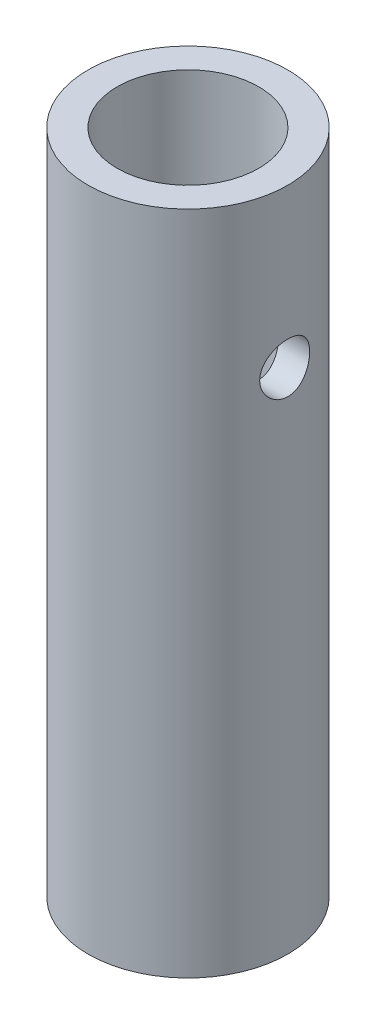
ISO-10303-21;
HEADER;
FILE_DESCRIPTION(('STEP AP214'),'2;1');
FILE_NAME('part.step','',(''),(''),'','','');
FILE_SCHEMA(('AUTOMOTIVE_DESIGN { 1 0 10303 214 1 1 1 1 }'));
ENDSEC;
DATA;
#1=APPLICATION_CONTEXT('core data for automotive mechanical design processes');
#2=APPLICATION_PROTOCOL_DEFINITION('international standard','automotive_design',2000,#1);
#3=PRODUCT_CONTEXT('',#1,'mechanical');
#4=PRODUCT('Part','Part','',(#3));
#5=PRODUCT_RELATED_PRODUCT_CATEGORY('part','',(#4));
#6=PRODUCT_DEFINITION_FORMATION('','',#4);
#7=PRODUCT_DEFINITION_CONTEXT('part definition',#1,'design');
#8=PRODUCT_DEFINITION('design','',#6,#7);
#9=PRODUCT_DEFINITION_SHAPE('','',#8);
#10=(LENGTH_UNIT() NAMED_UNIT(*) SI_UNIT(.MILLI.,.METRE.));
#11=(NAMED_UNIT(*) PLANE_ANGLE_UNIT() SI_UNIT($,.RADIAN.));
#12=(NAMED_UNIT(*) SI_UNIT($,.STERADIAN.) SOLID_ANGLE_UNIT());
#13=UNCERTAINTY_MEASURE_WITH_UNIT(LENGTH_MEASURE(1.E-05),#10,'distance_accuracy_value','');
#14=(GEOMETRIC_REPRESENTATION_CONTEXT(3) GLOBAL_UNCERTAINTY_ASSIGNED_CONTEXT((#13)) GLOBAL_UNIT_ASSIGNED_CONTEXT((#10,
#11,#12)) REPRESENTATION_CONTEXT('',''));
#15=CARTESIAN_POINT('',(0.,0.,0.));
#16=DIRECTION('',(0.,0.,1.));
#17=DIRECTION('',(1.,0.,0.));
#18=AXIS2_PLACEMENT_3D('',#15,#16,#17);
#19=CARTESIAN_POINT('',(0.,40.,0.));
#20=DIRECTION('',(0.,-1.,0.));
#21=DIRECTION('',(0.,0.,-1.));
#22=AXIS2_PLACEMENT_3D('',#19,#20,#21);
#23=CYLINDRICAL_SURFACE('',#22,6.);
#24=CARTESIAN_POINT('',(0.,40.,0.));
#25=DIRECTION('',(0.,1.,0.));
#26=DIRECTION('',(0.,0.,1.));
#27=AXIS2_PLACEMENT_3D('',#24,#25,#26);
#28=CIRCLE('',#27,6.);
#29=CARTESIAN_POINT('',(0.,40.,6.));
#30=VERTEX_POINT('',#29);
#31=EDGE_CURVE('E10',#30,#30,#28,.T.);
#32=ORIENTED_EDGE('',*,*,#31,.F.);
#33=EDGE_LOOP('',(#32));
#34=FACE_BOUND('',#33,.T.);
#35=CARTESIAN_POINT('',(0.,0.,0.));
#36=DIRECTION('',(0.,1.,0.));
#37=DIRECTION('',(0.,0.,1.));
#38=AXIS2_PLACEMENT_3D('',#35,#36,#37);
#39=CIRCLE('',#38,6.);
#40=CARTESIAN_POINT('',(0.,0.,6.));
#41=VERTEX_POINT('',#40);
#42=EDGE_CURVE('E51',#41,#41,#39,.T.);
#43=ORIENTED_EDGE('',*,*,#42,.T.);
#44=EDGE_LOOP('',(#43));
#45=FACE_BOUND('',#44,.T.);
#46=CARTESIAN_POINT('',(-5.80947501931113,30.5,1.5));
#47=CARTESIAN_POINT('',(-5.80947660051185,30.5828304505548,1.49999764715507));
#48=CARTESIAN_POINT('',(-5.81126583608348,30.6656869392068,1.49311574729838));
#49=CARTESIAN_POINT('',(-5.81821117195949,30.8290205469044,1.46581387527849));
#50=CARTESIAN_POINT('',(-5.82336923173088,30.909496252681,1.44538602404532));
#51=CARTESIAN_POINT('',(-5.8364323475758,31.0656821229122,1.39169471977917));
#52=CARTESIAN_POINT('',(-5.84433385614245,31.1413982932314,1.35844783671268));
#53=CARTESIAN_POINT('',(-5.86198915217285,31.2861865115239,1.28011268475685));
#54=CARTESIAN_POINT('',(-5.87174301827101,31.3552582772481,1.23502391313642));
#55=CARTESIAN_POINT('',(-5.89224429813367,31.4863169871573,1.13322505638713));
#56=CARTESIAN_POINT('',(-5.90300758573818,31.54813616021,1.07630213262243));
#57=CARTESIAN_POINT('',(-5.92417725309179,31.6614568366162,0.9529092384604));
#58=CARTESIAN_POINT('',(-5.93458359939834,31.7129573753731,0.886438376508187));
#59=CARTESIAN_POINT('',(-5.95404249312349,31.8048652805788,0.744687120647375));
#60=CARTESIAN_POINT('',(-5.96307412440355,31.8451078328969,0.669296745717073));
#61=CARTESIAN_POINT('',(-5.97858487155591,31.9122857864919,0.512557910575657));
#62=CARTESIAN_POINT('',(-5.98506436400607,31.9392231511493,0.431210331475164));
#63=CARTESIAN_POINT('',(-5.99462855308908,31.9784887007472,0.266615255252497));
#64=CARTESIAN_POINT('',(-5.99777936306589,31.9911017865959,0.183439631729385));
#65=CARTESIAN_POINT('',(-6.00056156464379,32.0022550275653,0.0160972915576614));
#66=CARTESIAN_POINT('',(-6.00019347658022,32.0007972633258,-0.0680692767228413));
#67=CARTESIAN_POINT('',(-5.99602856972121,31.9840550898499,-0.233028370758581));
#68=CARTESIAN_POINT('',(-5.99230801404524,31.9690782049677,-0.313854323401601));
#69=CARTESIAN_POINT('',(-5.98194501914912,31.9262172379709,-0.47180737112053));
#70=CARTESIAN_POINT('',(-5.97530242439065,31.8983324687736,-0.548934269055657));
#71=CARTESIAN_POINT('',(-5.95972505820537,31.8301984575878,-0.69811005525271));
#72=CARTESIAN_POINT('',(-5.95077011817032,31.789839773203,-0.770106764649756));
#73=CARTESIAN_POINT('',(-5.9315394228579,31.6979865925302,-0.906413433510732));
#74=CARTESIAN_POINT('',(-5.92126343791494,31.6464901588636,-0.970722052628257));
#75=CARTESIAN_POINT('',(-5.90018228261712,31.5321747548106,-1.09166105262743));
#76=CARTESIAN_POINT('',(-5.88937031715551,31.4690870645913,-1.1480365186128));
#77=CARTESIAN_POINT('',(-5.86869026110024,31.3342400158758,-1.24946456394453));
#78=CARTESIAN_POINT('',(-5.85882221463582,31.2624802523054,-1.29451661406903));
#79=CARTESIAN_POINT('',(-5.84112298098989,31.1118259795106,-1.3721821935339));
#80=CARTESIAN_POINT('',(-5.83330190235432,31.0328985618121,-1.40473435045574));
#81=CARTESIAN_POINT('',(-5.82071184083974,30.8704487191541,-1.45602843095451));
#82=CARTESIAN_POINT('',(-5.81594220486131,30.7869272816101,-1.47477330982937));
#83=CARTESIAN_POINT('',(-5.81013213623485,30.6200242990861,-1.49749778319911));
#84=CARTESIAN_POINT('',(-5.80899653456189,30.5366973240022,-1.50185428435178));
#85=CARTESIAN_POINT('',(-5.81032406088624,30.3705068380531,-1.49671019430933));
#86=CARTESIAN_POINT('',(-5.8127868576076,30.2876432852293,-1.48721087870928));
#87=CARTESIAN_POINT('',(-5.82094249172736,30.1261314410272,-1.4549552783626));
#88=CARTESIAN_POINT('',(-5.82658182140625,30.0474363640575,-1.43241844096905));
#89=CARTESIAN_POINT('',(-5.84040430962577,29.894941125289,-1.37497084900237));
#90=CARTESIAN_POINT('',(-5.84858776949168,29.8211415445668,-1.34005862862753));
#91=CARTESIAN_POINT('',(-5.86677682255957,29.6789352332796,-1.25806240076193));
#92=CARTESIAN_POINT('',(-5.87681501163985,29.6106626959741,-1.21075305230138));
#93=CARTESIAN_POINT('',(-5.8975024984303,29.4828869823192,-1.10559043940169));
#94=CARTESIAN_POINT('',(-5.90815189637082,29.42338525001,-1.04773544220816));
#95=CARTESIAN_POINT('',(-5.92918441818964,29.3133133744574,-0.921394081477092));
#96=CARTESIAN_POINT('',(-5.93955421237101,29.2630039624707,-0.852677928797392));
#97=CARTESIAN_POINT('',(-5.95858329968241,29.1746384798293,-0.707554024042016));
#98=CARTESIAN_POINT('',(-5.96724268202376,29.1365817700351,-0.631146673436389));
#99=CARTESIAN_POINT('',(-5.98182069442989,29.0741323792832,-0.473337302596637));
#100=CARTESIAN_POINT('',(-5.98775898013446,29.0496414293726,-0.391976071541823));
#101=CARTESIAN_POINT('',(-5.99631176037473,29.0147237992349,-0.226124640478213));
#102=CARTESIAN_POINT('',(-5.99892689636045,29.0042944047566,-0.141635047561867));
#103=CARTESIAN_POINT('',(-6.00051254113217,28.9979486156367,0.025625289664988));
#104=CARTESIAN_POINT('',(-5.99957968320012,29.0016474363569,0.108380740449049));
#105=CARTESIAN_POINT('',(-5.99438844686135,29.0225717409415,0.272051244622109));
#106=CARTESIAN_POINT('',(-5.99013016735643,29.0397968225196,0.352966352671329));
#107=CARTESIAN_POINT('',(-5.97878149280944,29.0870783296564,0.510256553467223));
#108=CARTESIAN_POINT('',(-5.97170646753999,29.1170651799719,0.586653741871528));
#109=CARTESIAN_POINT('',(-5.95546933370076,29.188955868529,0.733375579562202));
#110=CARTESIAN_POINT('',(-5.94630696206604,29.2308612090043,0.803699461897576));
#111=CARTESIAN_POINT('',(-5.92660874521999,29.3265728509956,0.938102892635849));
#112=CARTESIAN_POINT('',(-5.91604525418417,29.3806402143611,1.00199248245088));
#113=CARTESIAN_POINT('',(-5.89485973579863,29.4986342779607,1.11992253040688));
#114=CARTESIAN_POINT('',(-5.88423769428834,29.5625634741469,1.17396048760229));
#115=CARTESIAN_POINT('',(-5.86391213790822,29.699902121302,1.27164303971884));
#116=CARTESIAN_POINT('',(-5.85422945594827,29.7734661851189,1.31507492916982));
#117=CARTESIAN_POINT('',(-5.83715933325924,29.927083234884,1.3888903449235));
#118=CARTESIAN_POINT('',(-5.82977022370054,30.0071314491601,1.41928336463958));
#119=CARTESIAN_POINT('',(-5.81927863109675,30.1558655177401,1.46163379284816));
#120=CARTESIAN_POINT('',(-5.8156299450082,30.2238397465758,1.47598975589307));
#121=CARTESIAN_POINT('',(-5.81072757878358,30.3612033034999,1.4951734388599));
#122=CARTESIAN_POINT('',(-5.80947369434945,30.4305925103676,1.50000197155828));
#123=CARTESIAN_POINT('',(-5.80947501931113,30.5,1.5));
#124=B_SPLINE_CURVE_WITH_KNOTS('',3,(#46,#47,#48,#49,#50,#51,#52,#53,#54,#55,#56,#57,#58,#59,
#60,#61,#62,#63,#64,#65,#66,#67,#68,#69,#70,#71,#72,#73,#74,#75,#76,#77,#78,#79,#80,#81,#82,#83,
#84,#85,#86,#87,#88,#89,#90,#91,#92,#93,#94,#95,#96,#97,#98,#99,#100,#101,#102,#103,#104,#105,
#106,#107,#108,#109,#110,#111,#112,#113,#114,#115,#116,#117,#118,#119,#120,#121,#122,#123),
.UNSPECIFIED.,.T.,.F.,(4,2,2,2,2,2,2,2,2,2,2,2,2,2,2,2,2,2,2,2,2,2,2,2,2,2,2,2,2,2,2,2,2,2,2,2,
2,2,4),(0.,0.248236465041684,0.496617444857199,0.744678436299609,0.992749960532869,
1.24574372515786,1.4987611288792,1.75530897838752,2.01181895908256,2.26313250597208,
2.51440889199613,2.76010957613369,3.00582334034872,3.25375724552667,3.50173431281348,
3.75642279943147,4.01112318719882,4.26705859205041,4.52293920077729,4.7720614485703,
5.02116076310281,5.26618443005524,5.51123712852851,5.76109707515495,6.01099811331027,
6.26715198579192,6.52329249431732,6.77755243684158,7.03176329345423,7.27910067676474,
7.52643070426189,7.77242925935827,8.01845883442844,8.27038257949243,8.52237018939306,
8.77905886370807,9.03556032819973,9.24358696306399,9.45159585059714),.UNSPECIFIED.);
#125=CARTESIAN_POINT('',(-5.80947501931113,30.5,1.5));
#126=VERTEX_POINT('',#125);
#127=EDGE_CURVE('E79',#126,#126,#124,.T.);
#128=ORIENTED_EDGE('',*,*,#127,.F.);
#129=EDGE_LOOP('',(#128));
#130=FACE_BOUND('',#129,.T.);
#131=CARTESIAN_POINT('',(5.80947501931113,30.5,1.5));
#132=CARTESIAN_POINT('',(5.80947660051185,30.4171695494452,1.49999764715507));
#133=CARTESIAN_POINT('',(5.81126583608348,30.3343130607932,1.49311574729838));
#134=CARTESIAN_POINT('',(5.81821117195949,30.1709794530956,1.46581387527849));
#135=CARTESIAN_POINT('',(5.82336923173088,30.090503747319,1.44538602404532));
#136=CARTESIAN_POINT('',(5.8364323475758,29.9343178770878,1.39169471977917));
#137=CARTESIAN_POINT('',(5.84433385614245,29.8586017067686,1.35844783671268));
#138=CARTESIAN_POINT('',(5.86198915217285,29.713813488476,1.28011268475685));
#139=CARTESIAN_POINT('',(5.87174301827101,29.6447417227519,1.23502391313642));
#140=CARTESIAN_POINT('',(5.89224429813367,29.5136830128427,1.13322505638713));
#141=CARTESIAN_POINT('',(5.90300758573818,29.45186383979,1.07630213262243));
#142=CARTESIAN_POINT('',(5.92417725309178,29.3385431633838,0.952909238460402));
#143=CARTESIAN_POINT('',(5.93458359939834,29.287042624627,0.886438376508188));
#144=CARTESIAN_POINT('',(5.95404249312349,29.1951347194212,0.744687120647377));
#145=CARTESIAN_POINT('',(5.96307412440355,29.1548921671031,0.669296745717076));
#146=CARTESIAN_POINT('',(5.97858487155591,29.0877142135081,0.51255791057566));
#147=CARTESIAN_POINT('',(5.98506436400607,29.0607768488507,0.431210331475166));
#148=CARTESIAN_POINT('',(5.99462855308908,29.0215112992528,0.266615255252498));
#149=CARTESIAN_POINT('',(5.99777936306589,29.008898213404,0.183439631729386));
#150=CARTESIAN_POINT('',(6.00056156464379,28.9977449724347,0.0160972915576619));
#151=CARTESIAN_POINT('',(6.00019347658022,28.9992027366742,-0.0680692767228409));
#152=CARTESIAN_POINT('',(5.99602856972121,29.0159449101501,-0.23302837075858));
#153=CARTESIAN_POINT('',(5.99230801404524,29.0309217950323,-0.3138543234016));
#154=CARTESIAN_POINT('',(5.98194501914912,29.0737827620291,-0.471807371120529));
#155=CARTESIAN_POINT('',(5.97530242439065,29.1016675312264,-0.548934269055657));
#156=CARTESIAN_POINT('',(5.95972505820537,29.1698015424122,-0.69811005525271));
#157=CARTESIAN_POINT('',(5.95077011817032,29.210160226797,-0.770106764649757));
#158=CARTESIAN_POINT('',(5.9315394228579,29.3020134074698,-0.906413433510734));
#159=CARTESIAN_POINT('',(5.92126343791494,29.3535098411364,-0.970722052628259));
#160=CARTESIAN_POINT('',(5.90018228261712,29.4678252451894,-1.09166105262744));
#161=CARTESIAN_POINT('',(5.88937031715551,29.5309129354087,-1.1480365186128));
#162=CARTESIAN_POINT('',(5.86869026110024,29.6657599841242,-1.24946456394453));
#163=CARTESIAN_POINT('',(5.85882221463582,29.7375197476946,-1.29451661406903));
#164=CARTESIAN_POINT('',(5.84112298098989,29.8881740204894,-1.3721821935339));
#165=CARTESIAN_POINT('',(5.83330190235432,29.9671014381879,-1.40473435045574));
#166=CARTESIAN_POINT('',(5.82071184083974,30.1295512808459,-1.45602843095451));
#167=CARTESIAN_POINT('',(5.81594220486131,30.2130727183899,-1.47477330982937));
#168=CARTESIAN_POINT('',(5.81013213623485,30.3799757009139,-1.49749778319911));
#169=CARTESIAN_POINT('',(5.80899653456189,30.4633026759978,-1.50185428435178));
#170=CARTESIAN_POINT('',(5.81032406088624,30.6294931619469,-1.49671019430933));
#171=CARTESIAN_POINT('',(5.8127868576076,30.7123567147707,-1.48721087870928));
#172=CARTESIAN_POINT('',(5.82094249172736,30.8738685589728,-1.4549552783626));
#173=CARTESIAN_POINT('',(5.82658182140625,30.9525636359425,-1.43241844096905));
#174=CARTESIAN_POINT('',(5.84040430962577,31.105058874711,-1.37497084900237));
#175=CARTESIAN_POINT('',(5.84858776949168,31.1788584554332,-1.34005862862753));
#176=CARTESIAN_POINT('',(5.86677682255958,31.3210647667204,-1.25806240076194));
#177=CARTESIAN_POINT('',(5.87681501163985,31.3893373040259,-1.21075305230138));
#178=CARTESIAN_POINT('',(5.8975024984303,31.5171130176808,-1.10559043940169));
#179=CARTESIAN_POINT('',(5.90815189637082,31.57661474999,-1.04773544220816));
#180=CARTESIAN_POINT('',(5.92918441818964,31.6866866255426,-0.921394081477089));
#181=CARTESIAN_POINT('',(5.93955421237101,31.7369960375293,-0.852677928797391));
#182=CARTESIAN_POINT('',(5.95858329968241,31.8253615201708,-0.707554024042016));
#183=CARTESIAN_POINT('',(5.96724268202376,31.8634182299649,-0.63114667343639));
#184=CARTESIAN_POINT('',(5.98182069442989,31.9258676207168,-0.473337302596638));
#185=CARTESIAN_POINT('',(5.98775898013446,31.9503585706274,-0.391976071541824));
#186=CARTESIAN_POINT('',(5.99631176037473,31.985276200765,-0.226124640478213));
#187=CARTESIAN_POINT('',(5.99892689636045,31.9957055952434,-0.141635047561866));
#188=CARTESIAN_POINT('',(6.00051254113217,32.0020513843633,0.0256252896649896));
#189=CARTESIAN_POINT('',(5.99957968320012,31.9983525636431,0.10838074044905));
#190=CARTESIAN_POINT('',(5.99438844686135,31.9774282590585,0.272051244622109));
#191=CARTESIAN_POINT('',(5.99013016735643,31.9602031774803,0.352966352671329));
#192=CARTESIAN_POINT('',(5.97878149280944,31.9129216703436,0.510256553467222));
#193=CARTESIAN_POINT('',(5.97170646753999,31.8829348200281,0.586653741871527));
#194=CARTESIAN_POINT('',(5.95546933370076,31.811044131471,0.733375579562201));
#195=CARTESIAN_POINT('',(5.94630696206604,31.7691387909957,0.803699461897575));
#196=CARTESIAN_POINT('',(5.92660874522,31.6734271490044,0.938102892635848));
#197=CARTESIAN_POINT('',(5.91604525418417,31.6193597856389,1.00199248245088));
#198=CARTESIAN_POINT('',(5.89485973579863,31.5013657220393,1.11992253040688));
#199=CARTESIAN_POINT('',(5.88423769428834,31.4374365258531,1.17396048760229));
#200=CARTESIAN_POINT('',(5.86391213790822,31.300097878698,1.27164303971884));
#201=CARTESIAN_POINT('',(5.85422945594827,31.2265338148811,1.31507492916983));
#202=CARTESIAN_POINT('',(5.83715933325924,31.0729167651159,1.3888903449235));
#203=CARTESIAN_POINT('',(5.82977022370054,30.9928685508399,1.41928336463958));
#204=CARTESIAN_POINT('',(5.81927863109675,30.8441344822599,1.46163379284816));
#205=CARTESIAN_POINT('',(5.8156299450082,30.7761602534242,1.47598975589307));
#206=CARTESIAN_POINT('',(5.81072757878358,30.6387966965001,1.4951734388599));
#207=CARTESIAN_POINT('',(5.80947369434945,30.5694074896324,1.50000197155828));
#208=CARTESIAN_POINT('',(5.80947501931113,30.5,1.5));
#209=B_SPLINE_CURVE_WITH_KNOTS('',3,(#131,#132,#133,#134,#135,#136,#137,#138,#139,#140,#141,
#142,#143,#144,#145,#146,#147,#148,#149,#150,#151,#152,#153,#154,#155,#156,#157,#158,#159,#160,
#161,#162,#163,#164,#165,#166,#167,#168,#169,#170,#171,#172,#173,#174,#175,#176,#177,#178,#179,
#180,#181,#182,#183,#184,#185,#186,#187,#188,#189,#190,#191,#192,#193,#194,#195,#196,#197,#198,
#199,#200,#201,#202,#203,#204,#205,#206,#207,#208),.UNSPECIFIED.,.T.,.F.,(4,2,2,2,2,2,2,2,2,2,2,
2,2,2,2,2,2,2,2,2,2,2,2,2,2,2,2,2,2,2,2,2,2,2,2,2,2,2,4),(0.,0.248236465041684,
0.496617444857199,0.744678436299612,0.992749960532871,1.24574372515785,1.4987611288792,
1.75530897838752,2.01181895908256,2.26313250597208,2.51440889199613,2.76010957613368,
3.00582334034872,3.25375724552667,3.50173431281348,3.75642279943147,4.01112318719882,
4.26705859205042,4.52293920077729,4.7720614485703,5.02116076310281,5.26618443005524,
5.51123712852851,5.76109707515494,6.01099811331027,6.26715198579192,6.52329249431732,
6.77755243684158,7.03176329345424,7.27910067676475,7.52643070426189,7.77242925935827,
8.01845883442844,8.27038257949244,8.52237018939307,8.77905886370807,9.03556032819973,
9.24358696306399,9.45159585059714),.UNSPECIFIED.);
#210=CARTESIAN_POINT('',(5.80947501931113,30.5,1.5));
#211=VERTEX_POINT('',#210);
#212=EDGE_CURVE('E84',#211,#211,#209,.T.);
#213=ORIENTED_EDGE('',*,*,#212,.F.);
#214=EDGE_LOOP('',(#213));
#215=FACE_BOUND('',#214,.T.);
#216=ADVANCED_FACE('F38',(#34,#45,#130,#215),#23,.T.);
#217=CARTESIAN_POINT('',(0.,40.,0.));
#218=DIRECTION('',(0.,-1.,0.));
#219=DIRECTION('',(0.,0.,-1.));
#220=AXIS2_PLACEMENT_3D('',#217,#218,#219);
#221=CYLINDRICAL_SURFACE('',#220,4.25);
#222=CARTESIAN_POINT('',(-3.97649343014672,30.5,1.5));
#223=CARTESIAN_POINT('',(-3.97649214909622,30.5813864742169,1.50000149066615));
#224=CARTESIAN_POINT('',(-3.97901926460663,30.662762583927,1.4933539928128));
#225=CARTESIAN_POINT('',(-3.98879393121351,30.8230842274032,1.467043425783));
#226=CARTESIAN_POINT('',(-3.99604180849163,30.902029592822,1.44737945723028));
#227=CARTESIAN_POINT('',(-4.01433694093499,31.0551368954894,1.39582864763434));
#228=CARTESIAN_POINT('',(-4.02537600242114,31.1293087423376,1.3639681493962));
#229=CARTESIAN_POINT('',(-4.04999718693604,31.2712811871638,1.28902032615882));
#230=CARTESIAN_POINT('',(-4.06357997084496,31.3390801225159,1.24593008243685));
#231=CARTESIAN_POINT('',(-4.09242710764337,31.4693606669876,1.14771819298727));
#232=CARTESIAN_POINT('',(-4.10773694032568,31.5315220144668,1.09218496328606));
#233=CARTESIAN_POINT('',(-4.13793108703667,31.6458712021098,0.971539529215814));
#234=CARTESIAN_POINT('',(-4.15281532257706,31.6980572125901,0.906425571411499));
#235=CARTESIAN_POINT('',(-4.18101417320175,31.7924680486116,0.766084463279066));
#236=CARTESIAN_POINT('',(-4.1942691509212,31.8343515776355,0.690614666665436));
#237=CARTESIAN_POINT('',(-4.21717524967503,31.9046987868028,0.533151285128878));
#238=CARTESIAN_POINT('',(-4.22682746779623,31.9331665529137,0.451159695417228));
#239=CARTESIAN_POINT('',(-4.24111806230583,31.9747712078509,0.286342304623605));
#240=CARTESIAN_POINT('',(-4.24593576097444,31.9884579739153,0.203671152754863));
#241=CARTESIAN_POINT('',(-4.25065423277204,32.0018666773594,0.0370745275961789));
#242=CARTESIAN_POINT('',(-4.25055642363378,32.0015926413191,-0.0468505770469175));
#243=CARTESIAN_POINT('',(-4.24557303368344,31.9874232912814,-0.209658331252814));
#244=CARTESIAN_POINT('',(-4.24089784006484,31.9741265236597,-0.288600595765701));
#245=CARTESIAN_POINT('',(-4.22755452510655,31.9352867265176,-0.443051329641931));
#246=CARTESIAN_POINT('',(-4.21888612615129,31.9097428455486,-0.518559559863313));
#247=CARTESIAN_POINT('',(-4.1982765292198,31.8468179185946,-0.665236884092272));
#248=CARTESIAN_POINT('',(-4.18629157029728,31.8092774773812,-0.736331194343444));
#249=CARTESIAN_POINT('',(-4.16028068330646,31.7235605321457,-0.871378860385229));
#250=CARTESIAN_POINT('',(-4.14625414290584,31.6753808348373,-0.935330063534185));
#251=CARTESIAN_POINT('',(-4.11675686574673,31.5667961451757,-1.05782314621004));
#252=CARTESIAN_POINT('',(-4.10124896585007,31.5058830530521,-1.11590634661618));
#253=CARTESIAN_POINT('',(-4.07114153369187,31.3750652382269,-1.22119303639004));
#254=CARTESIAN_POINT('',(-4.05654217937968,31.3051587622379,-1.26839439928753));
#255=CARTESIAN_POINT('',(-4.02968687866734,31.1567241394834,-1.35131941506838));
#256=CARTESIAN_POINT('',(-4.01747692094867,31.0780654266004,-1.38682541655623));
#257=CARTESIAN_POINT('',(-3.99731320881638,30.9153432577668,-1.44392345851287));
#258=CARTESIAN_POINT('',(-3.98935740819944,30.8312824220132,-1.4655221892502));
#259=CARTESIAN_POINT('',(-3.97907468667611,30.6646290377137,-1.49320901940327));
#260=CARTESIAN_POINT('',(-3.97648696082043,30.5821721532977,-1.50001658316877));
#261=CARTESIAN_POINT('',(-3.97649991880842,30.4172714020355,-1.49998336545342));
#262=CARTESIAN_POINT('',(-3.97909950750846,30.3348275361158,-1.49314546479712));
#263=CARTESIAN_POINT('',(-3.98893187176901,30.1757508478637,-1.46666482624805));
#264=CARTESIAN_POINT('',(-3.99597453330859,30.0990175969826,-1.44754695230618));
#265=CARTESIAN_POINT('',(-4.01368284140357,29.9498718649589,-1.39769271168344));
#266=CARTESIAN_POINT('',(-4.02434917747315,29.8774602092162,-1.36695413368494));
#267=CARTESIAN_POINT('',(-4.04855743284535,29.7362399703153,-1.29353081699443));
#268=CARTESIAN_POINT('',(-4.06218587357297,29.667641918957,-1.25047047913953));
#269=CARTESIAN_POINT('',(-4.09062543004624,29.5383870228706,-1.15403941792047));
#270=CARTESIAN_POINT('',(-4.10543693318759,29.4777327966648,-1.10066530910848));
#271=CARTESIAN_POINT('',(-4.13555823449249,29.3626351361963,-0.981643183024891));
#272=CARTESIAN_POINT('',(-4.15085066581211,29.3087164130426,-0.915481737190287));
#273=CARTESIAN_POINT('',(-4.17941819461263,29.212699457551,-0.774672313060188));
#274=CARTESIAN_POINT('',(-4.19269333373818,29.1706009811825,-0.700024510011325));
#275=CARTESIAN_POINT('',(-4.21568899106777,29.0997665691171,-0.544606737072458));
#276=CARTESIAN_POINT('',(-4.22542849340978,29.0709590362114,-0.463872361931827));
#277=CARTESIAN_POINT('',(-4.24033266974149,29.0274703433744,-0.298287687197163));
#278=CARTESIAN_POINT('',(-4.24549921973348,29.0127833904205,-0.213439090498385));
#279=CARTESIAN_POINT('',(-4.25051699917857,28.9985225809158,-0.0468065677420776));
#280=CARTESIAN_POINT('',(-4.25063178196184,28.998199352349,0.0349059269684608));
#281=CARTESIAN_POINT('',(-4.24619950663751,29.0107904593098,0.197167452676125));
#282=CARTESIAN_POINT('',(-4.2416529069009,29.0237034932667,0.277716597280002));
#283=CARTESIAN_POINT('',(-4.2285169330624,29.0618879201956,0.433778286670084));
#284=CARTESIAN_POINT('',(-4.22000848234695,29.0869123164406,0.509358577607375));
#285=CARTESIAN_POINT('',(-4.19982799144413,29.1483731876769,0.655267438550127));
#286=CARTESIAN_POINT('',(-4.18815536109296,29.1848117917753,0.725595025728462));
#287=CARTESIAN_POINT('',(-4.16225918540311,29.2697166750237,0.862039823344104));
#288=CARTESIAN_POINT('',(-4.14795303334485,29.3186015187068,0.927880648538294));
#289=CARTESIAN_POINT('',(-4.11856748977774,29.4263238579255,1.05066387857035));
#290=CARTESIAN_POINT('',(-4.10348783821095,29.4851647162559,1.10760326426854));
#291=CARTESIAN_POINT('',(-4.0734305107236,29.6143088399735,1.21360605190335));
#292=CARTESIAN_POINT('',(-4.05848841916547,29.6850106894292,1.26219564892133));
#293=CARTESIAN_POINT('',(-4.03120773916043,29.8340490903233,1.34679190655785));
#294=CARTESIAN_POINT('',(-4.01886887914683,29.9123848441522,1.38279987993703));
#295=CARTESIAN_POINT('',(-3.99842733874428,30.0741858680611,1.4408433857428));
#296=CARTESIAN_POINT('',(-3.99030435945453,30.1576243548453,1.46294598203452));
#297=CARTESIAN_POINT('',(-3.97933932582699,30.3273800279806,1.49252005925822));
#298=CARTESIAN_POINT('',(-3.97649478860321,30.4136958414277,1.49999841926207));
#299=CARTESIAN_POINT('',(-3.97649343014672,30.5,1.5));
#300=B_SPLINE_CURVE_WITH_KNOTS('',3,(#222,#223,#224,#225,#226,#227,#228,#229,#230,#231,#232,
#233,#234,#235,#236,#237,#238,#239,#240,#241,#242,#243,#244,#245,#246,#247,#248,#249,#250,#251,
#252,#253,#254,#255,#256,#257,#258,#259,#260,#261,#262,#263,#264,#265,#266,#267,#268,#269,#270,
#271,#272,#273,#274,#275,#276,#277,#278,#279,#280,#281,#282,#283,#284,#285,#286,#287,#288,#289,
#290,#291,#292,#293,#294,#295,#296,#297,#298,#299),.UNSPECIFIED.,.T.,.F.,(4,2,2,2,2,2,2,2,2,2,2,
2,2,2,2,2,2,2,2,2,2,2,2,2,2,2,2,2,2,2,2,2,2,2,2,2,2,2,4),(0.,0.243839006544291,
0.487694862963852,0.73102696956356,0.974422383786315,1.22753298971473,1.48068997691713,
1.74135441615622,2.0019394148239,2.25245548997849,2.5028993116002,2.74234783916106,
2.98181301617189,3.22460232531389,3.46746460497961,3.72304556602679,3.97867642907768,
4.23882628514511,4.49885089914735,4.74591459605724,4.99292613850421,5.23002521944514,
5.46716944098184,5.7124961811414,5.95790358588543,6.216801511002,6.47569409074483,
6.73317526869983,6.99055076887334,7.23448201895285,7.47838928467028,7.71751952828778,
7.95669440376866,8.20532517639426,8.45404009608484,8.71402519995543,8.97398316899733,
9.23267758399595,9.49125028283082),.UNSPECIFIED.);
#301=CARTESIAN_POINT('',(-3.97649343014672,30.5,1.5));
#302=VERTEX_POINT('',#301);
#303=EDGE_CURVE('E61',#302,#302,#300,.T.);
#304=ORIENTED_EDGE('',*,*,#303,.T.);
#305=EDGE_LOOP('',(#304));
#306=FACE_BOUND('',#305,.T.);
#307=CARTESIAN_POINT('',(0.,40.,0.));
#308=DIRECTION('',(0.,1.,0.));
#309=DIRECTION('',(0.,0.,1.));
#310=AXIS2_PLACEMENT_3D('',#307,#308,#309);
#311=CIRCLE('',#310,4.25);
#312=CARTESIAN_POINT('',(0.,40.,4.25));
#313=VERTEX_POINT('',#312);
#314=EDGE_CURVE('E56',#313,#313,#311,.T.);
#315=ORIENTED_EDGE('',*,*,#314,.T.);
#316=EDGE_LOOP('',(#315));
#317=FACE_BOUND('',#316,.T.);
#318=CARTESIAN_POINT('',(0.,0.,0.));
#319=DIRECTION('',(0.,1.,0.));
#320=DIRECTION('',(0.,0.,1.));
#321=AXIS2_PLACEMENT_3D('',#318,#319,#320);
#322=CIRCLE('',#321,4.25);
#323=CARTESIAN_POINT('',(0.,0.,4.25));
#324=VERTEX_POINT('',#323);
#325=EDGE_CURVE('E59',#324,#324,#322,.T.);
#326=ORIENTED_EDGE('',*,*,#325,.F.);
#327=EDGE_LOOP('',(#326));
#328=FACE_BOUND('',#327,.T.);
#329=CARTESIAN_POINT('',(3.97649343014672,30.5,1.5));
#330=CARTESIAN_POINT('',(3.97649214909622,30.4186135257831,1.50000149066615));
#331=CARTESIAN_POINT('',(3.97901926460663,30.337237416073,1.4933539928128));
#332=CARTESIAN_POINT('',(3.98879393121351,30.1769157725968,1.467043425783));
#333=CARTESIAN_POINT('',(3.99604180849163,30.097970407178,1.44737945723028));
#334=CARTESIAN_POINT('',(4.01433694093499,29.9448631045106,1.39582864763434));
#335=CARTESIAN_POINT('',(4.02537600242114,29.8706912576624,1.3639681493962));
#336=CARTESIAN_POINT('',(4.04999718693604,29.7287188128362,1.28902032615883));
#337=CARTESIAN_POINT('',(4.06357997084496,29.6609198774841,1.24593008243685));
#338=CARTESIAN_POINT('',(4.09242710764337,29.5306393330124,1.14771819298727));
#339=CARTESIAN_POINT('',(4.10773694032568,29.4684779855332,1.09218496328607));
#340=CARTESIAN_POINT('',(4.13793108703667,29.3541287978902,0.971539529215814));
#341=CARTESIAN_POINT('',(4.15281532257706,29.3019427874099,0.906425571411499));
#342=CARTESIAN_POINT('',(4.18101417320175,29.2075319513884,0.766084463279065));
#343=CARTESIAN_POINT('',(4.1942691509212,29.1656484223645,0.690614666665436));
#344=CARTESIAN_POINT('',(4.21717524967502,29.0953012131972,0.53315128512888));
#345=CARTESIAN_POINT('',(4.22682746779622,29.0668334470863,0.45115969541723));
#346=CARTESIAN_POINT('',(4.24111806230583,29.0252287921491,0.286342304623608));
#347=CARTESIAN_POINT('',(4.24593576097444,29.0115420260847,0.203671152754866));
#348=CARTESIAN_POINT('',(4.25065423277204,28.9981333226406,0.0370745275961808));
#349=CARTESIAN_POINT('',(4.25055642363378,28.9984073586809,-0.0468505770469159));
#350=CARTESIAN_POINT('',(4.24557303368344,29.0125767087187,-0.209658331252813));
#351=CARTESIAN_POINT('',(4.24089784006484,29.0258734763403,-0.288600595765701));
#352=CARTESIAN_POINT('',(4.22755452510655,29.0647132734824,-0.44305132964193));
#353=CARTESIAN_POINT('',(4.21888612615129,29.0902571544514,-0.518559559863312));
#354=CARTESIAN_POINT('',(4.1982765292198,29.1531820814054,-0.665236884092271));
#355=CARTESIAN_POINT('',(4.18629157029728,29.1907225226188,-0.736331194343443));
#356=CARTESIAN_POINT('',(4.16028068330646,29.2764394678543,-0.871378860385228));
#357=CARTESIAN_POINT('',(4.14625414290584,29.3246191651626,-0.935330063534183));
#358=CARTESIAN_POINT('',(4.11675686574673,29.4332038548243,-1.05782314621004));
#359=CARTESIAN_POINT('',(4.10124896585007,29.4941169469479,-1.11590634661618));
#360=CARTESIAN_POINT('',(4.07114153369187,29.6249347617731,-1.22119303639004));
#361=CARTESIAN_POINT('',(4.05654217937968,29.6948412377621,-1.26839439928753));
#362=CARTESIAN_POINT('',(4.02968687866734,29.8432758605166,-1.35131941506838));
#363=CARTESIAN_POINT('',(4.01747692094867,29.9219345733996,-1.38682541655623));
#364=CARTESIAN_POINT('',(3.99731320881638,30.0846567422332,-1.44392345851287));
#365=CARTESIAN_POINT('',(3.98935740819944,30.1687175779868,-1.4655221892502));
#366=CARTESIAN_POINT('',(3.97907468667611,30.3353709622863,-1.49320901940327));
#367=CARTESIAN_POINT('',(3.97648696082043,30.4178278467023,-1.50001658316877));
#368=CARTESIAN_POINT('',(3.97649991880842,30.5827285979645,-1.49998336545342));
#369=CARTESIAN_POINT('',(3.97909950750846,30.6651724638842,-1.49314546479712));
#370=CARTESIAN_POINT('',(3.98893187176901,30.8242491521363,-1.46666482624805));
#371=CARTESIAN_POINT('',(3.99597453330859,30.9009824030174,-1.44754695230618));
#372=CARTESIAN_POINT('',(4.01368284140357,31.0501281350411,-1.39769271168344));
#373=CARTESIAN_POINT('',(4.02434917747315,31.1225397907838,-1.36695413368494));
#374=CARTESIAN_POINT('',(4.04855743284535,31.2637600296847,-1.29353081699443));
#375=CARTESIAN_POINT('',(4.06218587357297,31.332358081043,-1.25047047913953));
#376=CARTESIAN_POINT('',(4.09062543004624,31.4616129771294,-1.15403941792046));
#377=CARTESIAN_POINT('',(4.10543693318759,31.5222672033352,-1.10066530910848));
#378=CARTESIAN_POINT('',(4.13555823449249,31.6373648638037,-0.981643183024891));
#379=CARTESIAN_POINT('',(4.15085066581211,31.6912835869574,-0.915481737190286));
#380=CARTESIAN_POINT('',(4.17941819461262,31.787300542449,-0.774672313060187));
#381=CARTESIAN_POINT('',(4.19269333373818,31.8293990188175,-0.700024510011325));
#382=CARTESIAN_POINT('',(4.21568899106777,31.9002334308829,-0.544606737072459));
#383=CARTESIAN_POINT('',(4.22542849340978,31.9290409637886,-0.463872361931829));
#384=CARTESIAN_POINT('',(4.24033266974149,31.9725296566256,-0.298287687197164));
#385=CARTESIAN_POINT('',(4.24549921973348,31.9872166095795,-0.213439090498387));
#386=CARTESIAN_POINT('',(4.25051699917857,32.0014774190842,-0.0468065677420799));
#387=CARTESIAN_POINT('',(4.25063178196184,32.001800647651,0.0349059269684586));
#388=CARTESIAN_POINT('',(4.24619950663751,31.9892095406902,0.197167452676123));
#389=CARTESIAN_POINT('',(4.2416529069009,31.9762965067333,0.277716597280001));
#390=CARTESIAN_POINT('',(4.2285169330624,31.9381120798044,0.433778286670083));
#391=CARTESIAN_POINT('',(4.22000848234695,31.9130876835594,0.509358577607375));
#392=CARTESIAN_POINT('',(4.19982799144413,31.8516268123231,0.655267438550128));
#393=CARTESIAN_POINT('',(4.18815536109296,31.8151882082247,0.725595025728462));
#394=CARTESIAN_POINT('',(4.16225918540311,31.7302833249763,0.862039823344105));
#395=CARTESIAN_POINT('',(4.14795303334485,31.6813984812932,0.927880648538295));
#396=CARTESIAN_POINT('',(4.11856748977774,31.5736761420745,1.05066387857035));
#397=CARTESIAN_POINT('',(4.10348783821095,31.5148352837441,1.10760326426854));
#398=CARTESIAN_POINT('',(4.0734305107236,31.3856911600265,1.21360605190335));
#399=CARTESIAN_POINT('',(4.05848841916547,31.3149893105708,1.26219564892133));
#400=CARTESIAN_POINT('',(4.03120773916043,31.1659509096767,1.34679190655785));
#401=CARTESIAN_POINT('',(4.01886887914683,31.0876151558478,1.38279987993703));
#402=CARTESIAN_POINT('',(3.99842733874428,30.9258141319389,1.4408433857428));
#403=CARTESIAN_POINT('',(3.99030435945453,30.8423756451547,1.46294598203452));
#404=CARTESIAN_POINT('',(3.97933932582699,30.6726199720194,1.49252005925822));
#405=CARTESIAN_POINT('',(3.97649478860321,30.5863041585723,1.49999841926207));
#406=CARTESIAN_POINT('',(3.97649343014672,30.5,1.5));
#407=B_SPLINE_CURVE_WITH_KNOTS('',3,(#329,#330,#331,#332,#333,#334,#335,#336,#337,#338,#339,
#340,#341,#342,#343,#344,#345,#346,#347,#348,#349,#350,#351,#352,#353,#354,#355,#356,#357,#358,
#359,#360,#361,#362,#363,#364,#365,#366,#367,#368,#369,#370,#371,#372,#373,#374,#375,#376,#377,
#378,#379,#380,#381,#382,#383,#384,#385,#386,#387,#388,#389,#390,#391,#392,#393,#394,#395,#396,
#397,#398,#399,#400,#401,#402,#403,#404,#405,#406),.UNSPECIFIED.,.T.,.F.,(4,2,2,2,2,2,2,2,2,2,2,
2,2,2,2,2,2,2,2,2,2,2,2,2,2,2,2,2,2,2,2,2,2,2,2,2,2,2,4),(0.,0.243839006544291,
0.487694862963852,0.731026969563556,0.974422383786306,1.22753298971473,1.48068997691713,
1.74135441615622,2.0019394148239,2.25245548997849,2.5028993116002,2.74234783916106,
2.98181301617189,3.22460232531388,3.46746460497961,3.72304556602678,3.97867642907768,
4.23882628514511,4.49885089914735,4.74591459605723,4.99292613850421,5.23002521944514,
5.46716944098184,5.7124961811414,5.95790358588543,6.216801511002,6.47569409074483,
6.73317526869983,6.99055076887334,7.23448201895285,7.47838928467028,7.71751952828778,
7.95669440376866,8.20532517639427,8.45404009608483,8.71402519995543,8.97398316899733,
9.23267758399595,9.49125028283082),.UNSPECIFIED.);
#408=CARTESIAN_POINT('',(3.97649343014672,30.5,1.5));
#409=VERTEX_POINT('',#408);
#410=EDGE_CURVE('E42',#409,#409,#407,.T.);
#411=ORIENTED_EDGE('',*,*,#410,.T.);
#412=EDGE_LOOP('',(#411));
#413=FACE_BOUND('',#412,.T.);
#414=ADVANCED_FACE('F66',(#306,#317,#328,#413),#221,.F.);
#415=CARTESIAN_POINT('',(0.,40.,0.));
#416=DIRECTION('',(0.,1.,0.));
#417=DIRECTION('',(0.,0.,1.));
#418=AXIS2_PLACEMENT_3D('',#415,#416,#417);
#419=PLANE('',#418);
#420=ORIENTED_EDGE('',*,*,#31,.T.);
#421=EDGE_LOOP('',(#420));
#422=FACE_BOUND('',#421,.T.);
#423=ORIENTED_EDGE('',*,*,#314,.F.);
#424=EDGE_LOOP('',(#423));
#425=FACE_BOUND('',#424,.T.);
#426=ADVANCED_FACE('F99',(#422,#425),#419,.T.);
#427=CARTESIAN_POINT('',(0.,0.,0.));
#428=DIRECTION('',(0.,1.,0.));
#429=DIRECTION('',(0.,0.,1.));
#430=AXIS2_PLACEMENT_3D('',#427,#428,#429);
#431=PLANE('',#430);
#432=ORIENTED_EDGE('',*,*,#42,.F.);
#433=EDGE_LOOP('',(#432));
#434=FACE_BOUND('',#433,.T.);
#435=ORIENTED_EDGE('',*,*,#325,.T.);
#436=EDGE_LOOP('',(#435));
#437=FACE_BOUND('',#436,.T.);
#438=ADVANCED_FACE('F95',(#434,#437),#431,.F.);
#439=CARTESIAN_POINT('',(40.,30.5,0.));
#440=DIRECTION('',(-1.,0.,0.));
#441=DIRECTION('',(0.,0.,1.));
#442=AXIS2_PLACEMENT_3D('',#439,#440,#441);
#443=CYLINDRICAL_SURFACE('',#442,1.5);
#444=ORIENTED_EDGE('',*,*,#303,.F.);
#445=EDGE_LOOP('',(#444));
#446=FACE_BOUND('',#445,.T.);
#447=ORIENTED_EDGE('',*,*,#127,.T.);
#448=EDGE_LOOP('',(#447));
#449=FACE_BOUND('',#448,.T.);
#450=ADVANCED_FACE('F72',(#446,#449),#443,.F.);
#451=ORIENTED_EDGE('',*,*,#410,.F.);
#452=EDGE_LOOP('',(#451));
#453=FACE_BOUND('',#452,.T.);
#454=ORIENTED_EDGE('',*,*,#212,.T.);
#455=EDGE_LOOP('',(#454));
#456=FACE_BOUND('',#455,.T.);
#457=ADVANCED_FACE('F69',(#453,#456),#443,.F.);
#458=CLOSED_SHELL('',(#216,#414,#426,#438,#450,#457));
#459=MANIFOLD_SOLID_BREP('B2',#458);
#460=ADVANCED_BREP_SHAPE_REPRESENTATION('',(#18,#459),#14);
#461=SHAPE_DEFINITION_REPRESENTATION(#9,#460);
ENDSEC;
END-ISO-10303-21;
